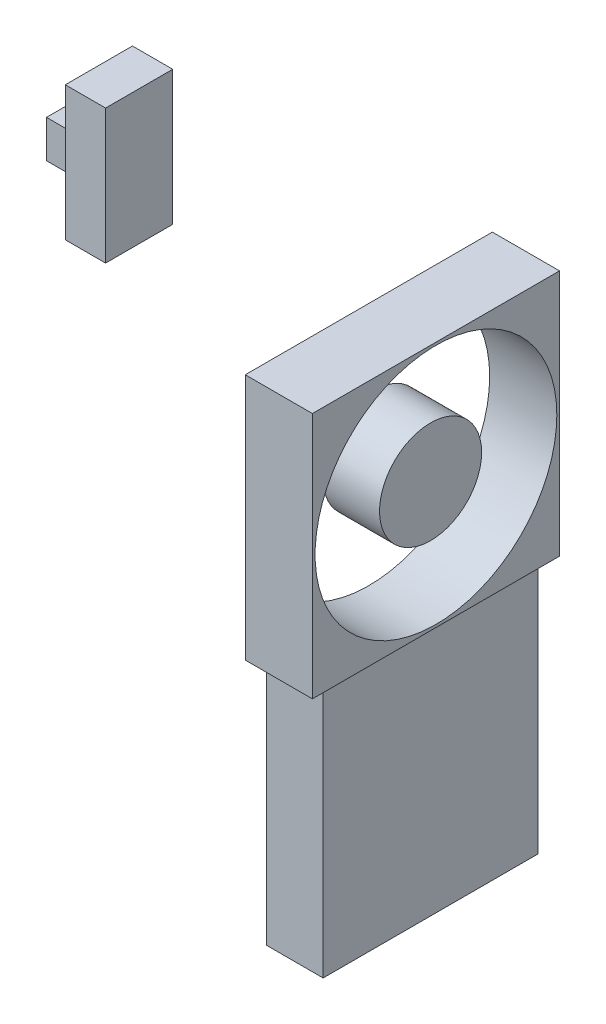
ISO-10303-21;
HEADER;
FILE_DESCRIPTION(('STEP AP214'),'2;1');
FILE_NAME('part.step','',(''),(''),'','','');
FILE_SCHEMA(('AUTOMOTIVE_DESIGN { 1 0 10303 214 1 1 1 1 }'));
ENDSEC;
DATA;
#1=APPLICATION_CONTEXT('core data for automotive mechanical design processes');
#2=APPLICATION_PROTOCOL_DEFINITION('international standard','automotive_design',2000,#1);
#3=PRODUCT_CONTEXT('',#1,'mechanical');
#4=PRODUCT('Part','Part','',(#3));
#5=PRODUCT_RELATED_PRODUCT_CATEGORY('part','',(#4));
#6=PRODUCT_DEFINITION_FORMATION('','',#4);
#7=PRODUCT_DEFINITION_CONTEXT('part definition',#1,'design');
#8=PRODUCT_DEFINITION('design','',#6,#7);
#9=PRODUCT_DEFINITION_SHAPE('','',#8);
#10=(LENGTH_UNIT() NAMED_UNIT(*) SI_UNIT(.MILLI.,.METRE.));
#11=(NAMED_UNIT(*) PLANE_ANGLE_UNIT() SI_UNIT($,.RADIAN.));
#12=(NAMED_UNIT(*) SI_UNIT($,.STERADIAN.) SOLID_ANGLE_UNIT());
#13=UNCERTAINTY_MEASURE_WITH_UNIT(LENGTH_MEASURE(1.E-05),#10,'distance_accuracy_value','');
#14=(GEOMETRIC_REPRESENTATION_CONTEXT(3) GLOBAL_UNCERTAINTY_ASSIGNED_CONTEXT((#13)) GLOBAL_UNIT_ASSIGNED_CONTEXT((#10,
#11,#12)) REPRESENTATION_CONTEXT('',''));
#15=CARTESIAN_POINT('',(0.,0.,0.));
#16=DIRECTION('',(0.,0.,1.));
#17=DIRECTION('',(1.,0.,0.));
#18=AXIS2_PLACEMENT_3D('',#15,#16,#17);
#19=CARTESIAN_POINT('',(95.,214.,42.));
#20=DIRECTION('',(0.,0.,-1.));
#21=DIRECTION('',(-1.,0.,0.));
#22=AXIS2_PLACEMENT_3D('',#19,#20,#21);
#23=PLANE('',#22);
#24=DIRECTION('',(0.,-1.,0.));
#25=VECTOR('',#24,1.);
#26=CARTESIAN_POINT('',(80.,214.,42.));
#27=LINE('',#26,#25);
#28=CARTESIAN_POINT('',(80.,228.,42.));
#29=VERTEX_POINT('',#28);
#30=CARTESIAN_POINT('',(80.,214.,42.));
#31=VERTEX_POINT('',#30);
#32=EDGE_CURVE('E115',#29,#31,#27,.T.);
#33=ORIENTED_EDGE('',*,*,#32,.T.);
#34=DIRECTION('',(-1.,0.,0.));
#35=VECTOR('',#34,1.);
#36=CARTESIAN_POINT('',(95.,214.,42.));
#37=LINE('',#36,#35);
#38=CARTESIAN_POINT('',(95.,214.,42.));
#39=VERTEX_POINT('',#38);
#40=EDGE_CURVE('E12',#39,#31,#37,.T.);
#41=ORIENTED_EDGE('',*,*,#40,.F.);
#42=DIRECTION('',(0.,-1.,0.));
#43=VECTOR('',#42,1.);
#44=CARTESIAN_POINT('',(95.,214.,42.));
#45=LINE('',#44,#43);
#46=CARTESIAN_POINT('',(95.,228.,42.));
#47=VERTEX_POINT('',#46);
#48=EDGE_CURVE('E103',#47,#39,#45,.T.);
#49=ORIENTED_EDGE('',*,*,#48,.F.);
#50=DIRECTION('',(-1.,0.,0.));
#51=VECTOR('',#50,1.);
#52=CARTESIAN_POINT('',(95.,228.,42.));
#53=LINE('',#52,#51);
#54=EDGE_CURVE('E111',#47,#29,#53,.T.);
#55=ORIENTED_EDGE('',*,*,#54,.T.);
#56=EDGE_LOOP('',(#33,#41,#49,#55));
#57=FACE_BOUND('',#56,.T.);
#58=ADVANCED_FACE('F52',(#57),#23,.F.);
#59=CARTESIAN_POINT('',(95.,214.,31.));
#60=DIRECTION('',(0.,1.,0.));
#61=DIRECTION('',(0.,0.,1.));
#62=AXIS2_PLACEMENT_3D('',#59,#60,#61);
#63=PLANE('',#62);
#64=DIRECTION('',(0.,0.,-1.));
#65=VECTOR('',#64,1.);
#66=CARTESIAN_POINT('',(80.,214.,31.));
#67=LINE('',#66,#65);
#68=CARTESIAN_POINT('',(80.,214.,31.));
#69=VERTEX_POINT('',#68);
#70=EDGE_CURVE('E107',#31,#69,#67,.T.);
#71=ORIENTED_EDGE('',*,*,#70,.T.);
#72=DIRECTION('',(-1.,0.,0.));
#73=VECTOR('',#72,1.);
#74=CARTESIAN_POINT('',(95.,214.,31.));
#75=LINE('',#74,#73);
#76=CARTESIAN_POINT('',(95.,214.,31.));
#77=VERTEX_POINT('',#76);
#78=EDGE_CURVE('E60',#77,#69,#75,.T.);
#79=ORIENTED_EDGE('',*,*,#78,.F.);
#80=DIRECTION('',(0.,0.,-1.));
#81=VECTOR('',#80,1.);
#82=CARTESIAN_POINT('',(95.,214.,31.));
#83=LINE('',#82,#81);
#84=EDGE_CURVE('E98',#39,#77,#83,.T.);
#85=ORIENTED_EDGE('',*,*,#84,.F.);
#86=ORIENTED_EDGE('',*,*,#40,.T.);
#87=EDGE_LOOP('',(#71,#79,#85,#86));
#88=FACE_BOUND('',#87,.T.);
#89=ADVANCED_FACE('F106',(#88),#63,.F.);
#90=CARTESIAN_POINT('',(95.,214.,31.));
#91=DIRECTION('',(0.,0.,1.));
#92=DIRECTION('',(1.,0.,0.));
#93=AXIS2_PLACEMENT_3D('',#90,#91,#92);
#94=PLANE('',#93);
#95=DIRECTION('',(0.,1.,0.));
#96=VECTOR('',#95,1.);
#97=CARTESIAN_POINT('',(80.,214.,31.));
#98=LINE('',#97,#96);
#99=CARTESIAN_POINT('',(80.,228.,31.));
#100=VERTEX_POINT('',#99);
#101=EDGE_CURVE('E85',#69,#100,#98,.T.);
#102=ORIENTED_EDGE('',*,*,#101,.T.);
#103=DIRECTION('',(-1.,0.,0.));
#104=VECTOR('',#103,1.);
#105=CARTESIAN_POINT('',(95.,228.,31.));
#106=LINE('',#105,#104);
#107=CARTESIAN_POINT('',(95.,228.,31.));
#108=VERTEX_POINT('',#107);
#109=EDGE_CURVE('E108',#108,#100,#106,.T.);
#110=ORIENTED_EDGE('',*,*,#109,.F.);
#111=DIRECTION('',(0.,1.,0.));
#112=VECTOR('',#111,1.);
#113=CARTESIAN_POINT('',(95.,214.,31.));
#114=LINE('',#113,#112);
#115=EDGE_CURVE('E101',#77,#108,#114,.T.);
#116=ORIENTED_EDGE('',*,*,#115,.F.);
#117=ORIENTED_EDGE('',*,*,#78,.T.);
#118=EDGE_LOOP('',(#102,#110,#116,#117));
#119=FACE_BOUND('',#118,.T.);
#120=ADVANCED_FACE('F109',(#119),#94,.F.);
#121=CARTESIAN_POINT('',(95.,228.,31.));
#122=DIRECTION('',(0.,-1.,0.));
#123=DIRECTION('',(0.,0.,-1.));
#124=AXIS2_PLACEMENT_3D('',#121,#122,#123);
#125=PLANE('',#124);
#126=DIRECTION('',(0.,0.,1.));
#127=VECTOR('',#126,1.);
#128=CARTESIAN_POINT('',(80.,228.,31.));
#129=LINE('',#128,#127);
#130=EDGE_CURVE('E91',#100,#29,#129,.T.);
#131=ORIENTED_EDGE('',*,*,#130,.T.);
#132=ORIENTED_EDGE('',*,*,#54,.F.);
#133=DIRECTION('',(0.,0.,1.));
#134=VECTOR('',#133,1.);
#135=CARTESIAN_POINT('',(95.,228.,31.));
#136=LINE('',#135,#134);
#137=EDGE_CURVE('E68',#108,#47,#136,.T.);
#138=ORIENTED_EDGE('',*,*,#137,.F.);
#139=ORIENTED_EDGE('',*,*,#109,.T.);
#140=EDGE_LOOP('',(#131,#132,#138,#139));
#141=FACE_BOUND('',#140,.T.);
#142=ADVANCED_FACE('F122',(#141),#125,.F.);
#143=CARTESIAN_POINT('',(95.,0.,0.));
#144=DIRECTION('',(1.,0.,0.));
#145=DIRECTION('',(0.,0.,-1.));
#146=AXIS2_PLACEMENT_3D('',#143,#144,#145);
#147=PLANE('',#146);
#148=ORIENTED_EDGE('',*,*,#48,.T.);
#149=ORIENTED_EDGE('',*,*,#84,.T.);
#150=ORIENTED_EDGE('',*,*,#115,.T.);
#151=ORIENTED_EDGE('',*,*,#137,.T.);
#152=EDGE_LOOP('',(#148,#149,#150,#151));
#153=FACE_BOUND('',#152,.T.);
#154=ADVANCED_FACE('F99',(#153),#147,.T.);
#155=CARTESIAN_POINT('',(80.,0.,0.));
#156=DIRECTION('',(1.,0.,0.));
#157=DIRECTION('',(0.,0.,-1.));
#158=AXIS2_PLACEMENT_3D('',#155,#156,#157);
#159=PLANE('',#158);
#160=ORIENTED_EDGE('',*,*,#32,.F.);
#161=ORIENTED_EDGE('',*,*,#130,.F.);
#162=ORIENTED_EDGE('',*,*,#101,.F.);
#163=ORIENTED_EDGE('',*,*,#70,.F.);
#164=EDGE_LOOP('',(#160,#161,#162,#163));
#165=FACE_BOUND('',#164,.T.);
#166=ADVANCED_FACE('F125',(#165),#159,.F.);
#167=CLOSED_SHELL('',(#58,#89,#120,#142,#154,#166));
#168=MANIFOLD_SOLID_BREP('B2',#167);
#169=CARTESIAN_POINT('',(110.,200.,50.));
#170=DIRECTION('',(0.,0.,-1.));
#171=DIRECTION('',(-1.,0.,0.));
#172=AXIS2_PLACEMENT_3D('',#169,#170,#171);
#173=PLANE('',#172);
#174=DIRECTION('',(0.,-1.,0.));
#175=VECTOR('',#174,1.);
#176=CARTESIAN_POINT('',(95.,200.,50.));
#177=LINE('',#176,#175);
#178=CARTESIAN_POINT('',(95.,250.,50.));
#179=VERTEX_POINT('',#178);
#180=CARTESIAN_POINT('',(95.,200.,50.));
#181=VERTEX_POINT('',#180);
#182=EDGE_CURVE('E249',#179,#181,#177,.T.);
#183=ORIENTED_EDGE('',*,*,#182,.T.);
#184=DIRECTION('',(-1.,0.,0.));
#185=VECTOR('',#184,1.);
#186=CARTESIAN_POINT('',(110.,200.,50.));
#187=LINE('',#186,#185);
#188=CARTESIAN_POINT('',(110.,200.,50.));
#189=VERTEX_POINT('',#188);
#190=EDGE_CURVE('E50',#189,#181,#187,.T.);
#191=ORIENTED_EDGE('',*,*,#190,.F.);
#192=DIRECTION('',(0.,-1.,0.));
#193=VECTOR('',#192,1.);
#194=CARTESIAN_POINT('',(110.,200.,50.));
#195=LINE('',#194,#193);
#196=CARTESIAN_POINT('',(110.,250.,50.));
#197=VERTEX_POINT('',#196);
#198=EDGE_CURVE('E237',#197,#189,#195,.T.);
#199=ORIENTED_EDGE('',*,*,#198,.F.);
#200=DIRECTION('',(-1.,0.,0.));
#201=VECTOR('',#200,1.);
#202=CARTESIAN_POINT('',(110.,250.,50.));
#203=LINE('',#202,#201);
#204=EDGE_CURVE('E245',#197,#179,#203,.T.);
#205=ORIENTED_EDGE('',*,*,#204,.T.);
#206=EDGE_LOOP('',(#183,#191,#199,#205));
#207=FACE_BOUND('',#206,.T.);
#208=ADVANCED_FACE('F186',(#207),#173,.F.);
#209=CARTESIAN_POINT('',(110.,200.,25.));
#210=DIRECTION('',(0.,1.,0.));
#211=DIRECTION('',(0.,0.,1.));
#212=AXIS2_PLACEMENT_3D('',#209,#210,#211);
#213=PLANE('',#212);
#214=DIRECTION('',(0.,0.,-1.));
#215=VECTOR('',#214,1.);
#216=CARTESIAN_POINT('',(95.,200.,25.));
#217=LINE('',#216,#215);
#218=CARTESIAN_POINT('',(95.,200.,25.));
#219=VERTEX_POINT('',#218);
#220=EDGE_CURVE('E241',#181,#219,#217,.T.);
#221=ORIENTED_EDGE('',*,*,#220,.T.);
#222=DIRECTION('',(-1.,0.,0.));
#223=VECTOR('',#222,1.);
#224=CARTESIAN_POINT('',(110.,200.,25.));
#225=LINE('',#224,#223);
#226=CARTESIAN_POINT('',(110.,200.,25.));
#227=VERTEX_POINT('',#226);
#228=EDGE_CURVE('E194',#227,#219,#225,.T.);
#229=ORIENTED_EDGE('',*,*,#228,.F.);
#230=DIRECTION('',(0.,0.,-1.));
#231=VECTOR('',#230,1.);
#232=CARTESIAN_POINT('',(110.,200.,25.));
#233=LINE('',#232,#231);
#234=EDGE_CURVE('E232',#189,#227,#233,.T.);
#235=ORIENTED_EDGE('',*,*,#234,.F.);
#236=ORIENTED_EDGE('',*,*,#190,.T.);
#237=EDGE_LOOP('',(#221,#229,#235,#236));
#238=FACE_BOUND('',#237,.T.);
#239=ADVANCED_FACE('F240',(#238),#213,.F.);
#240=CARTESIAN_POINT('',(110.,200.,25.));
#241=DIRECTION('',(0.,0.,1.));
#242=DIRECTION('',(1.,0.,0.));
#243=AXIS2_PLACEMENT_3D('',#240,#241,#242);
#244=PLANE('',#243);
#245=DIRECTION('',(0.,1.,0.));
#246=VECTOR('',#245,1.);
#247=CARTESIAN_POINT('',(95.,200.,25.));
#248=LINE('',#247,#246);
#249=CARTESIAN_POINT('',(95.,250.,25.));
#250=VERTEX_POINT('',#249);
#251=EDGE_CURVE('E219',#219,#250,#248,.T.);
#252=ORIENTED_EDGE('',*,*,#251,.T.);
#253=DIRECTION('',(-1.,0.,0.));
#254=VECTOR('',#253,1.);
#255=CARTESIAN_POINT('',(110.,250.,25.));
#256=LINE('',#255,#254);
#257=CARTESIAN_POINT('',(110.,250.,25.));
#258=VERTEX_POINT('',#257);
#259=EDGE_CURVE('E242',#258,#250,#256,.T.);
#260=ORIENTED_EDGE('',*,*,#259,.F.);
#261=DIRECTION('',(0.,1.,0.));
#262=VECTOR('',#261,1.);
#263=CARTESIAN_POINT('',(110.,200.,25.));
#264=LINE('',#263,#262);
#265=EDGE_CURVE('E235',#227,#258,#264,.T.);
#266=ORIENTED_EDGE('',*,*,#265,.F.);
#267=ORIENTED_EDGE('',*,*,#228,.T.);
#268=EDGE_LOOP('',(#252,#260,#266,#267));
#269=FACE_BOUND('',#268,.T.);
#270=ADVANCED_FACE('F243',(#269),#244,.F.);
#271=CARTESIAN_POINT('',(110.,250.,25.));
#272=DIRECTION('',(0.,-1.,0.));
#273=DIRECTION('',(0.,0.,-1.));
#274=AXIS2_PLACEMENT_3D('',#271,#272,#273);
#275=PLANE('',#274);
#276=DIRECTION('',(0.,0.,1.));
#277=VECTOR('',#276,1.);
#278=CARTESIAN_POINT('',(95.,250.,25.));
#279=LINE('',#278,#277);
#280=EDGE_CURVE('E225',#250,#179,#279,.T.);
#281=ORIENTED_EDGE('',*,*,#280,.T.);
#282=ORIENTED_EDGE('',*,*,#204,.F.);
#283=DIRECTION('',(0.,0.,1.));
#284=VECTOR('',#283,1.);
#285=CARTESIAN_POINT('',(110.,250.,25.));
#286=LINE('',#285,#284);
#287=EDGE_CURVE('E202',#258,#197,#286,.T.);
#288=ORIENTED_EDGE('',*,*,#287,.F.);
#289=ORIENTED_EDGE('',*,*,#259,.T.);
#290=EDGE_LOOP('',(#281,#282,#288,#289));
#291=FACE_BOUND('',#290,.T.);
#292=ADVANCED_FACE('F256',(#291),#275,.F.);
#293=CARTESIAN_POINT('',(110.,0.,0.));
#294=DIRECTION('',(1.,0.,0.));
#295=DIRECTION('',(0.,0.,-1.));
#296=AXIS2_PLACEMENT_3D('',#293,#294,#295);
#297=PLANE('',#296);
#298=ORIENTED_EDGE('',*,*,#198,.T.);
#299=ORIENTED_EDGE('',*,*,#234,.T.);
#300=ORIENTED_EDGE('',*,*,#265,.T.);
#301=ORIENTED_EDGE('',*,*,#287,.T.);
#302=EDGE_LOOP('',(#298,#299,#300,#301));
#303=FACE_BOUND('',#302,.T.);
#304=ADVANCED_FACE('F233',(#303),#297,.T.);
#305=CARTESIAN_POINT('',(95.,0.,0.));
#306=DIRECTION('',(1.,0.,0.));
#307=DIRECTION('',(0.,0.,-1.));
#308=AXIS2_PLACEMENT_3D('',#305,#306,#307);
#309=PLANE('',#308);
#310=ORIENTED_EDGE('',*,*,#182,.F.);
#311=ORIENTED_EDGE('',*,*,#280,.F.);
#312=ORIENTED_EDGE('',*,*,#251,.F.);
#313=ORIENTED_EDGE('',*,*,#220,.F.);
#314=EDGE_LOOP('',(#310,#311,#312,#313));
#315=FACE_BOUND('',#314,.T.);
#316=ADVANCED_FACE('F259',(#315),#309,.F.);
#317=CLOSED_SHELL('',(#208,#239,#270,#292,#304,#316));
#318=MANIFOLD_SOLID_BREP('B6',#317);
#319=CARTESIAN_POINT('',(181.,0.,40.));
#320=DIRECTION('',(0.,0.,-1.));
#321=DIRECTION('',(-1.,0.,0.));
#322=AXIS2_PLACEMENT_3D('',#319,#320,#321);
#323=PLANE('',#322);
#324=DIRECTION('',(0.,-1.,0.));
#325=VECTOR('',#324,1.);
#326=CARTESIAN_POINT('',(160.,0.,40.));
#327=LINE('',#326,#325);
#328=CARTESIAN_POINT('',(160.,94.,40.));
#329=VERTEX_POINT('',#328);
#330=CARTESIAN_POINT('',(160.,0.,40.));
#331=VERTEX_POINT('',#330);
#332=EDGE_CURVE('E381',#329,#331,#327,.T.);
#333=ORIENTED_EDGE('',*,*,#332,.T.);
#334=DIRECTION('',(-1.,0.,0.));
#335=VECTOR('',#334,1.);
#336=CARTESIAN_POINT('',(181.,0.,40.));
#337=LINE('',#336,#335);
#338=CARTESIAN_POINT('',(181.,0.,40.));
#339=VERTEX_POINT('',#338);
#340=EDGE_CURVE('E184',#339,#331,#337,.T.);
#341=ORIENTED_EDGE('',*,*,#340,.F.);
#342=DIRECTION('',(0.,-1.,0.));
#343=VECTOR('',#342,1.);
#344=CARTESIAN_POINT('',(181.,0.,40.));
#345=LINE('',#344,#343);
#346=CARTESIAN_POINT('',(181.,94.,40.));
#347=VERTEX_POINT('',#346);
#348=EDGE_CURVE('E369',#347,#339,#345,.T.);
#349=ORIENTED_EDGE('',*,*,#348,.F.);
#350=DIRECTION('',(-1.,0.,0.));
#351=VECTOR('',#350,1.);
#352=CARTESIAN_POINT('',(181.,94.,40.));
#353=LINE('',#352,#351);
#354=EDGE_CURVE('E377',#347,#329,#353,.T.);
#355=ORIENTED_EDGE('',*,*,#354,.T.);
#356=EDGE_LOOP('',(#333,#341,#349,#355));
#357=FACE_BOUND('',#356,.T.);
#358=ADVANCED_FACE('F318',(#357),#323,.F.);
#359=CARTESIAN_POINT('',(181.,0.,-40.));
#360=DIRECTION('',(0.,1.,0.));
#361=DIRECTION('',(0.,0.,1.));
#362=AXIS2_PLACEMENT_3D('',#359,#360,#361);
#363=PLANE('',#362);
#364=DIRECTION('',(0.,0.,-1.));
#365=VECTOR('',#364,1.);
#366=CARTESIAN_POINT('',(160.,0.,-40.));
#367=LINE('',#366,#365);
#368=CARTESIAN_POINT('',(160.,0.,-40.));
#369=VERTEX_POINT('',#368);
#370=EDGE_CURVE('E373',#331,#369,#367,.T.);
#371=ORIENTED_EDGE('',*,*,#370,.T.);
#372=DIRECTION('',(-1.,0.,0.));
#373=VECTOR('',#372,1.);
#374=CARTESIAN_POINT('',(181.,0.,-40.));
#375=LINE('',#374,#373);
#376=CARTESIAN_POINT('',(181.,0.,-40.));
#377=VERTEX_POINT('',#376);
#378=EDGE_CURVE('E326',#377,#369,#375,.T.);
#379=ORIENTED_EDGE('',*,*,#378,.F.);
#380=DIRECTION('',(0.,0.,-1.));
#381=VECTOR('',#380,1.);
#382=CARTESIAN_POINT('',(181.,0.,-40.));
#383=LINE('',#382,#381);
#384=EDGE_CURVE('E364',#339,#377,#383,.T.);
#385=ORIENTED_EDGE('',*,*,#384,.F.);
#386=ORIENTED_EDGE('',*,*,#340,.T.);
#387=EDGE_LOOP('',(#371,#379,#385,#386));
#388=FACE_BOUND('',#387,.T.);
#389=ADVANCED_FACE('F372',(#388),#363,.F.);
#390=CARTESIAN_POINT('',(181.,0.,-40.));
#391=DIRECTION('',(0.,0.,1.));
#392=DIRECTION('',(1.,0.,0.));
#393=AXIS2_PLACEMENT_3D('',#390,#391,#392);
#394=PLANE('',#393);
#395=DIRECTION('',(0.,1.,0.));
#396=VECTOR('',#395,1.);
#397=CARTESIAN_POINT('',(160.,0.,-40.));
#398=LINE('',#397,#396);
#399=CARTESIAN_POINT('',(160.,94.,-40.));
#400=VERTEX_POINT('',#399);
#401=EDGE_CURVE('E351',#369,#400,#398,.T.);
#402=ORIENTED_EDGE('',*,*,#401,.T.);
#403=DIRECTION('',(-1.,0.,0.));
#404=VECTOR('',#403,1.);
#405=CARTESIAN_POINT('',(181.,94.,-40.));
#406=LINE('',#405,#404);
#407=CARTESIAN_POINT('',(181.,94.,-40.));
#408=VERTEX_POINT('',#407);
#409=EDGE_CURVE('E374',#408,#400,#406,.T.);
#410=ORIENTED_EDGE('',*,*,#409,.F.);
#411=DIRECTION('',(0.,1.,0.));
#412=VECTOR('',#411,1.);
#413=CARTESIAN_POINT('',(181.,0.,-40.));
#414=LINE('',#413,#412);
#415=EDGE_CURVE('E367',#377,#408,#414,.T.);
#416=ORIENTED_EDGE('',*,*,#415,.F.);
#417=ORIENTED_EDGE('',*,*,#378,.T.);
#418=EDGE_LOOP('',(#402,#410,#416,#417));
#419=FACE_BOUND('',#418,.T.);
#420=ADVANCED_FACE('F375',(#419),#394,.F.);
#421=CARTESIAN_POINT('',(181.,94.,-40.));
#422=DIRECTION('',(0.,-1.,0.));
#423=DIRECTION('',(0.,0.,-1.));
#424=AXIS2_PLACEMENT_3D('',#421,#422,#423);
#425=PLANE('',#424);
#426=DIRECTION('',(0.,0.,1.));
#427=VECTOR('',#426,1.);
#428=CARTESIAN_POINT('',(160.,94.,-40.));
#429=LINE('',#428,#427);
#430=EDGE_CURVE('E357',#400,#329,#429,.T.);
#431=ORIENTED_EDGE('',*,*,#430,.T.);
#432=ORIENTED_EDGE('',*,*,#354,.F.);
#433=DIRECTION('',(0.,0.,1.));
#434=VECTOR('',#433,1.);
#435=CARTESIAN_POINT('',(181.,94.,-40.));
#436=LINE('',#435,#434);
#437=EDGE_CURVE('E334',#408,#347,#436,.T.);
#438=ORIENTED_EDGE('',*,*,#437,.F.);
#439=ORIENTED_EDGE('',*,*,#409,.T.);
#440=EDGE_LOOP('',(#431,#432,#438,#439));
#441=FACE_BOUND('',#440,.T.);
#442=ADVANCED_FACE('F388',(#441),#425,.F.);
#443=CARTESIAN_POINT('',(181.,0.,0.));
#444=DIRECTION('',(1.,0.,0.));
#445=DIRECTION('',(0.,0.,-1.));
#446=AXIS2_PLACEMENT_3D('',#443,#444,#445);
#447=PLANE('',#446);
#448=ORIENTED_EDGE('',*,*,#348,.T.);
#449=ORIENTED_EDGE('',*,*,#384,.T.);
#450=ORIENTED_EDGE('',*,*,#415,.T.);
#451=ORIENTED_EDGE('',*,*,#437,.T.);
#452=EDGE_LOOP('',(#448,#449,#450,#451));
#453=FACE_BOUND('',#452,.T.);
#454=ADVANCED_FACE('F365',(#453),#447,.T.);
#455=CARTESIAN_POINT('',(160.,0.,0.));
#456=DIRECTION('',(1.,0.,0.));
#457=DIRECTION('',(0.,0.,-1.));
#458=AXIS2_PLACEMENT_3D('',#455,#456,#457);
#459=PLANE('',#458);
#460=ORIENTED_EDGE('',*,*,#332,.F.);
#461=ORIENTED_EDGE('',*,*,#430,.F.);
#462=ORIENTED_EDGE('',*,*,#401,.F.);
#463=ORIENTED_EDGE('',*,*,#370,.F.);
#464=EDGE_LOOP('',(#460,#461,#462,#463));
#465=FACE_BOUND('',#464,.T.);
#466=ADVANCED_FACE('F391',(#465),#459,.F.);
#467=CLOSED_SHELL('',(#358,#389,#420,#442,#454,#466));
#468=MANIFOLD_SOLID_BREP('B44',#467);
#469=CARTESIAN_POINT('',(181.,140.,0.));
#470=DIRECTION('',(-1.,0.,0.));
#471=DIRECTION('',(0.,0.,1.));
#472=AXIS2_PLACEMENT_3D('',#469,#470,#471);
#473=CYLINDRICAL_SURFACE('',#472,19.);
#474=CARTESIAN_POINT('',(181.,140.,0.));
#475=DIRECTION('',(1.,0.,0.));
#476=DIRECTION('',(0.,0.,-1.));
#477=AXIS2_PLACEMENT_3D('',#474,#475,#476);
#478=CIRCLE('',#477,19.);
#479=CARTESIAN_POINT('',(181.,140.,-19.));
#480=VERTEX_POINT('',#479);
#481=EDGE_CURVE('E317',#480,#480,#478,.T.);
#482=ORIENTED_EDGE('',*,*,#481,.F.);
#483=EDGE_LOOP('',(#482));
#484=FACE_BOUND('',#483,.T.);
#485=CARTESIAN_POINT('',(160.,140.,0.));
#486=DIRECTION('',(1.,0.,0.));
#487=DIRECTION('',(0.,0.,-1.));
#488=AXIS2_PLACEMENT_3D('',#485,#486,#487);
#489=CIRCLE('',#488,19.);
#490=CARTESIAN_POINT('',(160.,140.,-19.));
#491=VERTEX_POINT('',#490);
#492=EDGE_CURVE('E454',#491,#491,#489,.T.);
#493=ORIENTED_EDGE('',*,*,#492,.T.);
#494=EDGE_LOOP('',(#493));
#495=FACE_BOUND('',#494,.T.);
#496=ADVANCED_FACE('F451',(#484,#495),#473,.T.);
#497=CARTESIAN_POINT('',(181.,140.,0.));
#498=DIRECTION('',(1.,0.,0.));
#499=DIRECTION('',(0.,0.,-1.));
#500=AXIS2_PLACEMENT_3D('',#497,#498,#499);
#501=PLANE('',#500);
#502=ORIENTED_EDGE('',*,*,#481,.T.);
#503=EDGE_LOOP('',(#502));
#504=FACE_BOUND('',#503,.T.);
#505=ADVANCED_FACE('F466',(#504),#501,.T.);
#506=CARTESIAN_POINT('',(160.,140.,0.));
#507=DIRECTION('',(1.,0.,0.));
#508=DIRECTION('',(0.,0.,-1.));
#509=AXIS2_PLACEMENT_3D('',#506,#507,#508);
#510=PLANE('',#509);
#511=ORIENTED_EDGE('',*,*,#492,.F.);
#512=EDGE_LOOP('',(#511));
#513=FACE_BOUND('',#512,.T.);
#514=ADVANCED_FACE('F464',(#513),#510,.F.);
#515=CLOSED_SHELL('',(#496,#505,#514));
#516=MANIFOLD_SOLID_BREP('B178',#515);
#517=CARTESIAN_POINT('',(183.,94.,46.));
#518=DIRECTION('',(0.,0.,-1.));
#519=DIRECTION('',(-1.,0.,0.));
#520=AXIS2_PLACEMENT_3D('',#517,#518,#519);
#521=PLANE('',#520);
#522=DIRECTION('',(0.,-1.,0.));
#523=VECTOR('',#522,1.);
#524=CARTESIAN_POINT('',(158.,94.,46.));
#525=LINE('',#524,#523);
#526=CARTESIAN_POINT('',(158.,186.,46.));
#527=VERTEX_POINT('',#526);
#528=CARTESIAN_POINT('',(158.,94.,46.));
#529=VERTEX_POINT('',#528);
#530=EDGE_CURVE('E557',#527,#529,#525,.T.);
#531=ORIENTED_EDGE('',*,*,#530,.T.);
#532=DIRECTION('',(-1.,0.,0.));
#533=VECTOR('',#532,1.);
#534=CARTESIAN_POINT('',(183.,94.,46.));
#535=LINE('',#534,#533);
#536=CARTESIAN_POINT('',(183.,94.,46.));
#537=VERTEX_POINT('',#536);
#538=EDGE_CURVE('E449',#537,#529,#535,.T.);
#539=ORIENTED_EDGE('',*,*,#538,.F.);
#540=DIRECTION('',(0.,-1.,0.));
#541=VECTOR('',#540,1.);
#542=CARTESIAN_POINT('',(183.,94.,46.));
#543=LINE('',#542,#541);
#544=CARTESIAN_POINT('',(183.,186.,46.));
#545=VERTEX_POINT('',#544);
#546=EDGE_CURVE('E544',#545,#537,#543,.T.);
#547=ORIENTED_EDGE('',*,*,#546,.F.);
#548=DIRECTION('',(-1.,0.,0.));
#549=VECTOR('',#548,1.);
#550=CARTESIAN_POINT('',(183.,186.,46.));
#551=LINE('',#550,#549);
#552=EDGE_CURVE('E553',#545,#527,#551,.T.);
#553=ORIENTED_EDGE('',*,*,#552,.T.);
#554=EDGE_LOOP('',(#531,#539,#547,#553));
#555=FACE_BOUND('',#554,.T.);
#556=ADVANCED_FACE('F492',(#555),#521,.F.);
#557=CARTESIAN_POINT('',(183.,94.,-46.));
#558=DIRECTION('',(0.,1.,0.));
#559=DIRECTION('',(0.,0.,1.));
#560=AXIS2_PLACEMENT_3D('',#557,#558,#559);
#561=PLANE('',#560);
#562=DIRECTION('',(0.,0.,-1.));
#563=VECTOR('',#562,1.);
#564=CARTESIAN_POINT('',(158.,94.,-46.));
#565=LINE('',#564,#563);
#566=CARTESIAN_POINT('',(158.,94.,-46.));
#567=VERTEX_POINT('',#566);
#568=EDGE_CURVE('E548',#529,#567,#565,.T.);
#569=ORIENTED_EDGE('',*,*,#568,.T.);
#570=DIRECTION('',(-1.,0.,0.));
#571=VECTOR('',#570,1.);
#572=CARTESIAN_POINT('',(183.,94.,-46.));
#573=LINE('',#572,#571);
#574=CARTESIAN_POINT('',(183.,94.,-46.));
#575=VERTEX_POINT('',#574);
#576=EDGE_CURVE('E501',#575,#567,#573,.T.);
#577=ORIENTED_EDGE('',*,*,#576,.F.);
#578=DIRECTION('',(0.,0.,-1.));
#579=VECTOR('',#578,1.);
#580=CARTESIAN_POINT('',(183.,94.,-46.));
#581=LINE('',#580,#579);
#582=EDGE_CURVE('E539',#537,#575,#581,.T.);
#583=ORIENTED_EDGE('',*,*,#582,.F.);
#584=ORIENTED_EDGE('',*,*,#538,.T.);
#585=EDGE_LOOP('',(#569,#577,#583,#584));
#586=FACE_BOUND('',#585,.T.);
#587=ADVANCED_FACE('F547',(#586),#561,.F.);
#588=CARTESIAN_POINT('',(183.,94.,-46.));
#589=DIRECTION('',(0.,0.,1.));
#590=DIRECTION('',(1.,0.,0.));
#591=AXIS2_PLACEMENT_3D('',#588,#589,#590);
#592=PLANE('',#591);
#593=DIRECTION('',(0.,1.,0.));
#594=VECTOR('',#593,1.);
#595=CARTESIAN_POINT('',(158.,94.,-46.));
#596=LINE('',#595,#594);
#597=CARTESIAN_POINT('',(158.,186.,-46.));
#598=VERTEX_POINT('',#597);
#599=EDGE_CURVE('E526',#567,#598,#596,.T.);
#600=ORIENTED_EDGE('',*,*,#599,.T.);
#601=DIRECTION('',(-1.,0.,0.));
#602=VECTOR('',#601,1.);
#603=CARTESIAN_POINT('',(183.,186.,-46.));
#604=LINE('',#603,#602);
#605=CARTESIAN_POINT('',(183.,186.,-46.));
#606=VERTEX_POINT('',#605);
#607=EDGE_CURVE('E549',#606,#598,#604,.T.);
#608=ORIENTED_EDGE('',*,*,#607,.F.);
#609=DIRECTION('',(0.,1.,0.));
#610=VECTOR('',#609,1.);
#611=CARTESIAN_POINT('',(183.,94.,-46.));
#612=LINE('',#611,#610);
#613=EDGE_CURVE('E542',#575,#606,#612,.T.);
#614=ORIENTED_EDGE('',*,*,#613,.F.);
#615=ORIENTED_EDGE('',*,*,#576,.T.);
#616=EDGE_LOOP('',(#600,#608,#614,#615));
#617=FACE_BOUND('',#616,.T.);
#618=ADVANCED_FACE('F551',(#617),#592,.F.);
#619=CARTESIAN_POINT('',(183.,186.,-46.));
#620=DIRECTION('',(0.,-1.,0.));
#621=DIRECTION('',(0.,0.,-1.));
#622=AXIS2_PLACEMENT_3D('',#619,#620,#621);
#623=PLANE('',#622);
#624=DIRECTION('',(0.,0.,1.));
#625=VECTOR('',#624,1.);
#626=CARTESIAN_POINT('',(158.,186.,-46.));
#627=LINE('',#626,#625);
#628=EDGE_CURVE('E532',#598,#527,#627,.T.);
#629=ORIENTED_EDGE('',*,*,#628,.T.);
#630=ORIENTED_EDGE('',*,*,#552,.F.);
#631=DIRECTION('',(0.,0.,1.));
#632=VECTOR('',#631,1.);
#633=CARTESIAN_POINT('',(183.,186.,-46.));
#634=LINE('',#633,#632);
#635=EDGE_CURVE('E509',#606,#545,#634,.T.);
#636=ORIENTED_EDGE('',*,*,#635,.F.);
#637=ORIENTED_EDGE('',*,*,#607,.T.);
#638=EDGE_LOOP('',(#629,#630,#636,#637));
#639=FACE_BOUND('',#638,.T.);
#640=ADVANCED_FACE('F565',(#639),#623,.F.);
#641=CARTESIAN_POINT('',(183.,0.,0.));
#642=DIRECTION('',(1.,0.,0.));
#643=DIRECTION('',(0.,0.,-1.));
#644=AXIS2_PLACEMENT_3D('',#641,#642,#643);
#645=PLANE('',#644);
#646=CARTESIAN_POINT('',(183.,140.,0.));
#647=DIRECTION('',(1.,0.,0.));
#648=DIRECTION('',(0.,0.,-1.));
#649=AXIS2_PLACEMENT_3D('',#646,#647,#648);
#650=CIRCLE('',#649,45.);
#651=CARTESIAN_POINT('',(183.,140.,-45.));
#652=VERTEX_POINT('',#651);
#653=EDGE_CURVE('E560',#652,#652,#650,.F.);
#654=ORIENTED_EDGE('',*,*,#653,.T.);
#655=EDGE_LOOP('',(#654));
#656=FACE_BOUND('',#655,.T.);
#657=ORIENTED_EDGE('',*,*,#546,.T.);
#658=ORIENTED_EDGE('',*,*,#582,.T.);
#659=ORIENTED_EDGE('',*,*,#613,.T.);
#660=ORIENTED_EDGE('',*,*,#635,.T.);
#661=EDGE_LOOP('',(#657,#658,#659,#660));
#662=FACE_BOUND('',#661,.T.);
#663=ADVANCED_FACE('F540',(#656,#662),#645,.T.);
#664=CARTESIAN_POINT('',(158.,0.,0.));
#665=DIRECTION('',(1.,0.,0.));
#666=DIRECTION('',(0.,0.,-1.));
#667=AXIS2_PLACEMENT_3D('',#664,#665,#666);
#668=PLANE('',#667);
#669=CARTESIAN_POINT('',(158.,140.,0.));
#670=DIRECTION('',(1.,0.,0.));
#671=DIRECTION('',(0.,0.,-1.));
#672=AXIS2_PLACEMENT_3D('',#669,#670,#671);
#673=CIRCLE('',#672,45.);
#674=CARTESIAN_POINT('',(158.,140.,-45.));
#675=VERTEX_POINT('',#674);
#676=EDGE_CURVE('E495',#675,#675,#673,.F.);
#677=ORIENTED_EDGE('',*,*,#676,.F.);
#678=EDGE_LOOP('',(#677));
#679=FACE_BOUND('',#678,.T.);
#680=ORIENTED_EDGE('',*,*,#530,.F.);
#681=ORIENTED_EDGE('',*,*,#628,.F.);
#682=ORIENTED_EDGE('',*,*,#599,.F.);
#683=ORIENTED_EDGE('',*,*,#568,.F.);
#684=EDGE_LOOP('',(#680,#681,#682,#683));
#685=FACE_BOUND('',#684,.T.);
#686=ADVANCED_FACE('F568',(#679,#685),#668,.F.);
#687=CARTESIAN_POINT('',(184.,140.,0.));
#688=DIRECTION('',(-1.,0.,0.));
#689=DIRECTION('',(0.,0.,1.));
#690=AXIS2_PLACEMENT_3D('',#687,#688,#689);
#691=CYLINDRICAL_SURFACE('',#690,45.);
#692=ORIENTED_EDGE('',*,*,#653,.F.);
#693=EDGE_LOOP('',(#692));
#694=FACE_BOUND('',#693,.T.);
#695=ORIENTED_EDGE('',*,*,#676,.T.);
#696=EDGE_LOOP('',(#695));
#697=FACE_BOUND('',#696,.T.);
#698=ADVANCED_FACE('F577',(#694,#697),#691,.F.);
#699=CLOSED_SHELL('',(#556,#587,#618,#640,#663,#686,#698));
#700=MANIFOLD_SOLID_BREP('B312',#699);
#701=ADVANCED_BREP_SHAPE_REPRESENTATION('',(#18,#168,#318,#468,#516,#700),#14);
#702=SHAPE_DEFINITION_REPRESENTATION(#9,#701);
ENDSEC;
END-ISO-10303-21;
